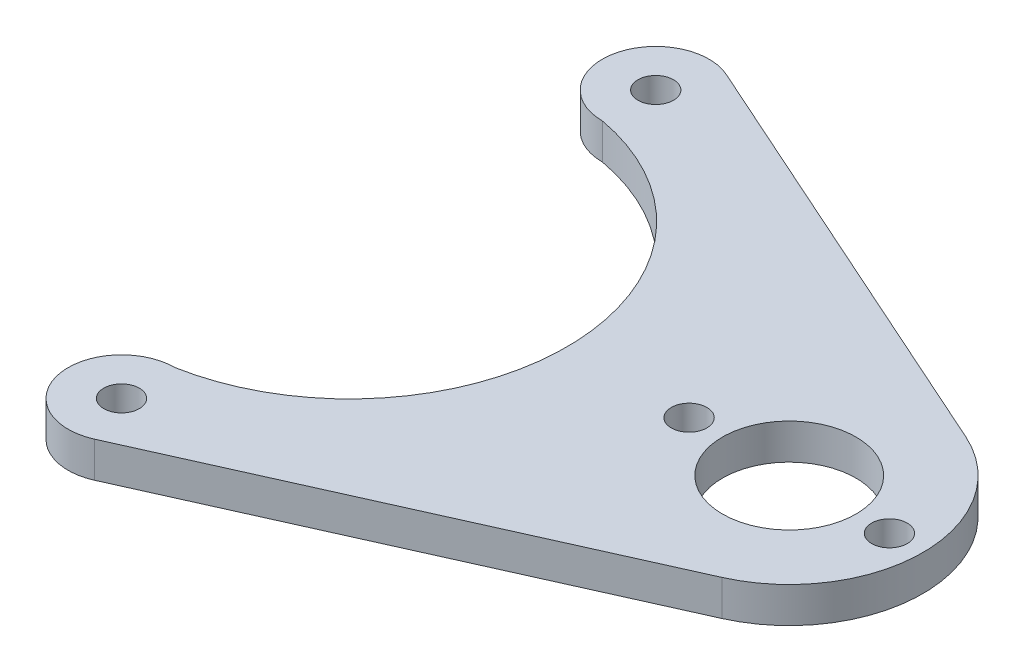
ISO-10303-21;
HEADER;
FILE_DESCRIPTION(('STEP AP214'),'2;1');
FILE_NAME('part.step','',(''),(''),'','','');
FILE_SCHEMA(('AUTOMOTIVE_DESIGN { 1 0 10303 214 1 1 1 1 }'));
ENDSEC;
DATA;
#1=APPLICATION_CONTEXT('core data for automotive mechanical design processes');
#2=APPLICATION_PROTOCOL_DEFINITION('international standard','automotive_design',2000,#1);
#3=PRODUCT_CONTEXT('',#1,'mechanical');
#4=PRODUCT('Part','Part','',(#3));
#5=PRODUCT_RELATED_PRODUCT_CATEGORY('part','',(#4));
#6=PRODUCT_DEFINITION_FORMATION('','',#4);
#7=PRODUCT_DEFINITION_CONTEXT('part definition',#1,'design');
#8=PRODUCT_DEFINITION('design','',#6,#7);
#9=PRODUCT_DEFINITION_SHAPE('','',#8);
#10=(LENGTH_UNIT() NAMED_UNIT(*) SI_UNIT(.MILLI.,.METRE.));
#11=(NAMED_UNIT(*) PLANE_ANGLE_UNIT() SI_UNIT($,.RADIAN.));
#12=(NAMED_UNIT(*) SI_UNIT($,.STERADIAN.) SOLID_ANGLE_UNIT());
#13=UNCERTAINTY_MEASURE_WITH_UNIT(LENGTH_MEASURE(1.E-05),#10,'distance_accuracy_value','');
#14=(GEOMETRIC_REPRESENTATION_CONTEXT(3) GLOBAL_UNCERTAINTY_ASSIGNED_CONTEXT((#13)) GLOBAL_UNIT_ASSIGNED_CONTEXT((#10,
#11,#12)) REPRESENTATION_CONTEXT('',''));
#15=CARTESIAN_POINT('',(0.,0.,0.));
#16=DIRECTION('',(0.,0.,1.));
#17=DIRECTION('',(1.,0.,0.));
#18=AXIS2_PLACEMENT_3D('',#15,#16,#17);
#19=CARTESIAN_POINT('',(-90.,8.,-60.));
#20=DIRECTION('',(0.,1.,0.));
#21=DIRECTION('',(0.,0.,1.));
#22=AXIS2_PLACEMENT_3D('',#19,#20,#21);
#23=PLANE('',#22);
#24=CARTESIAN_POINT('',(-22.5,8.,0.));
#25=DIRECTION('',(0.,1.,0.));
#26=DIRECTION('',(0.,0.,1.));
#27=AXIS2_PLACEMENT_3D('',#24,#25,#26);
#28=CIRCLE('',#27,4.);
#29=CARTESIAN_POINT('',(-22.5,8.,4.));
#30=VERTEX_POINT('',#29);
#31=EDGE_CURVE('E203',#30,#30,#28,.T.);
#32=ORIENTED_EDGE('',*,*,#31,.F.);
#33=EDGE_LOOP('',(#32));
#34=FACE_BOUND('',#33,.T.);
#35=CARTESIAN_POINT('',(-90.,8.,60.));
#36=DIRECTION('',(0.,1.,0.));
#37=DIRECTION('',(0.,0.,1.));
#38=AXIS2_PLACEMENT_3D('',#35,#36,#37);
#39=CIRCLE('',#38,4.00000000000001);
#40=CARTESIAN_POINT('',(-90.,8.,64.));
#41=VERTEX_POINT('',#40);
#42=EDGE_CURVE('E215',#41,#41,#39,.T.);
#43=ORIENTED_EDGE('',*,*,#42,.F.);
#44=EDGE_LOOP('',(#43));
#45=FACE_BOUND('',#44,.T.);
#46=CARTESIAN_POINT('',(-90.,8.,-60.));
#47=DIRECTION('',(0.,1.,0.));
#48=DIRECTION('',(0.,0.,1.));
#49=AXIS2_PLACEMENT_3D('',#46,#47,#48);
#50=CIRCLE('',#49,12.);
#51=CARTESIAN_POINT('',(-85.0979487379824,8.,-70.9530768930265));
#52=VERTEX_POINT('',#51);
#53=CARTESIAN_POINT('',(-90.,8.,-48.));
#54=VERTEX_POINT('',#53);
#55=EDGE_CURVE('E139',#52,#54,#50,.T.);
#56=ORIENTED_EDGE('',*,*,#55,.T.);
#57=CARTESIAN_POINT('',(-98.8,8.,0.));
#58=DIRECTION('',(0.,-1.,0.));
#59=DIRECTION('',(0.,0.,-1.));
#60=AXIS2_PLACEMENT_3D('',#57,#58,#59);
#61=CIRCLE('',#60,48.8);
#62=CARTESIAN_POINT('',(-90.,8.,48.));
#63=VERTEX_POINT('',#62);
#64=EDGE_CURVE('E97',#54,#63,#61,.T.);
#65=ORIENTED_EDGE('',*,*,#64,.T.);
#66=CARTESIAN_POINT('',(-90.,8.,60.));
#67=DIRECTION('',(0.,1.,0.));
#68=DIRECTION('',(0.,0.,1.));
#69=AXIS2_PLACEMENT_3D('',#66,#67,#68);
#70=CIRCLE('',#69,12.);
#71=CARTESIAN_POINT('',(-85.0979487379823,8.,70.9530768930265));
#72=VERTEX_POINT('',#71);
#73=EDGE_CURVE('E110',#63,#72,#70,.T.);
#74=ORIENTED_EDGE('',*,*,#73,.T.);
#75=DIRECTION('',(0.912756407752208,0.,-0.408504271834806));
#76=VECTOR('',#75,1.);
#77=CARTESIAN_POINT('',(12.2551281550442,8.,27.3826922325662));
#78=LINE('',#77,#76);
#79=CARTESIAN_POINT('',(12.2551281550442,8.,27.3826922325662));
#80=VERTEX_POINT('',#79);
#81=EDGE_CURVE('E104',#72,#80,#78,.T.);
#82=ORIENTED_EDGE('',*,*,#81,.T.);
#83=CARTESIAN_POINT('',(0.,8.,0.));
#84=DIRECTION('',(0.,1.,0.));
#85=DIRECTION('',(0.,0.,1.));
#86=AXIS2_PLACEMENT_3D('',#83,#84,#85);
#87=CIRCLE('',#86,30.);
#88=CARTESIAN_POINT('',(12.2551281550442,8.,-27.3826922325663));
#89=VERTEX_POINT('',#88);
#90=EDGE_CURVE('E108',#80,#89,#87,.T.);
#91=ORIENTED_EDGE('',*,*,#90,.T.);
#92=DIRECTION('',(-0.912756407752208,0.,-0.408504271834805));
#93=VECTOR('',#92,1.);
#94=CARTESIAN_POINT('',(-85.0979487379824,8.,-70.9530768930265));
#95=LINE('',#94,#93);
#96=EDGE_CURVE('E60',#89,#52,#95,.T.);
#97=ORIENTED_EDGE('',*,*,#96,.T.);
#98=EDGE_LOOP('',(#56,#65,#74,#82,#91,#97));
#99=FACE_BOUND('',#98,.T.);
#100=CARTESIAN_POINT('',(-90.,8.,-60.));
#101=DIRECTION('',(0.,1.,0.));
#102=DIRECTION('',(0.,0.,1.));
#103=AXIS2_PLACEMENT_3D('',#100,#101,#102);
#104=CIRCLE('',#103,4.00000000000001);
#105=CARTESIAN_POINT('',(-90.,8.,-56.));
#106=VERTEX_POINT('',#105);
#107=EDGE_CURVE('E132',#106,#106,#104,.T.);
#108=ORIENTED_EDGE('',*,*,#107,.F.);
#109=EDGE_LOOP('',(#108));
#110=FACE_BOUND('',#109,.T.);
#111=CARTESIAN_POINT('',(22.5,8.,0.));
#112=DIRECTION('',(0.,1.,0.));
#113=DIRECTION('',(0.,0.,1.));
#114=AXIS2_PLACEMENT_3D('',#111,#112,#113);
#115=CIRCLE('',#114,4.);
#116=CARTESIAN_POINT('',(22.5,8.,4.));
#117=VERTEX_POINT('',#116);
#118=EDGE_CURVE('E209',#117,#117,#115,.T.);
#119=ORIENTED_EDGE('',*,*,#118,.F.);
#120=EDGE_LOOP('',(#119));
#121=FACE_BOUND('',#120,.T.);
#122=CARTESIAN_POINT('',(0.,8.,0.));
#123=DIRECTION('',(0.,1.,0.));
#124=DIRECTION('',(0.,0.,1.));
#125=AXIS2_PLACEMENT_3D('',#122,#123,#124);
#126=CIRCLE('',#125,15.);
#127=CARTESIAN_POINT('',(0.,8.,15.));
#128=VERTEX_POINT('',#127);
#129=EDGE_CURVE('E194',#128,#128,#126,.T.);
#130=ORIENTED_EDGE('',*,*,#129,.F.);
#131=EDGE_LOOP('',(#130));
#132=FACE_BOUND('',#131,.T.);
#133=ADVANCED_FACE('F43',(#34,#45,#99,#110,#121,#132),#23,.T.);
#134=CARTESIAN_POINT('',(-90.,0.,-60.));
#135=DIRECTION('',(0.,1.,0.));
#136=DIRECTION('',(0.,0.,1.));
#137=AXIS2_PLACEMENT_3D('',#134,#135,#136);
#138=PLANE('',#137);
#139=CARTESIAN_POINT('',(-90.,0.,-60.));
#140=DIRECTION('',(0.,1.,0.));
#141=DIRECTION('',(0.,0.,1.));
#142=AXIS2_PLACEMENT_3D('',#139,#140,#141);
#143=CIRCLE('',#142,12.);
#144=CARTESIAN_POINT('',(-85.0979487379824,0.,-70.9530768930265));
#145=VERTEX_POINT('',#144);
#146=CARTESIAN_POINT('',(-90.,0.,-48.));
#147=VERTEX_POINT('',#146);
#148=EDGE_CURVE('E128',#145,#147,#143,.T.);
#149=ORIENTED_EDGE('',*,*,#148,.F.);
#150=DIRECTION('',(-0.912756407752208,0.,-0.408504271834805));
#151=VECTOR('',#150,1.);
#152=CARTESIAN_POINT('',(-85.0979487379824,0.,-70.9530768930265));
#153=LINE('',#152,#151);
#154=CARTESIAN_POINT('',(12.2551281550442,0.,-27.3826922325663));
#155=VERTEX_POINT('',#154);
#156=EDGE_CURVE('E89',#155,#145,#153,.T.);
#157=ORIENTED_EDGE('',*,*,#156,.F.);
#158=CARTESIAN_POINT('',(0.,0.,0.));
#159=DIRECTION('',(0.,1.,0.));
#160=DIRECTION('',(0.,0.,1.));
#161=AXIS2_PLACEMENT_3D('',#158,#159,#160);
#162=CIRCLE('',#161,30.);
#163=CARTESIAN_POINT('',(12.2551281550442,0.,27.3826922325662));
#164=VERTEX_POINT('',#163);
#165=EDGE_CURVE('E83',#164,#155,#162,.T.);
#166=ORIENTED_EDGE('',*,*,#165,.F.);
#167=DIRECTION('',(0.912756407752208,0.,-0.408504271834806));
#168=VECTOR('',#167,1.);
#169=CARTESIAN_POINT('',(12.2551281550442,0.,27.3826922325662));
#170=LINE('',#169,#168);
#171=CARTESIAN_POINT('',(-85.0979487379823,0.,70.9530768930265));
#172=VERTEX_POINT('',#171);
#173=EDGE_CURVE('E118',#172,#164,#170,.T.);
#174=ORIENTED_EDGE('',*,*,#173,.F.);
#175=CARTESIAN_POINT('',(-90.,0.,60.));
#176=DIRECTION('',(0.,1.,0.));
#177=DIRECTION('',(0.,0.,1.));
#178=AXIS2_PLACEMENT_3D('',#175,#176,#177);
#179=CIRCLE('',#178,12.);
#180=CARTESIAN_POINT('',(-90.,0.,48.));
#181=VERTEX_POINT('',#180);
#182=EDGE_CURVE('E134',#181,#172,#179,.T.);
#183=ORIENTED_EDGE('',*,*,#182,.F.);
#184=CARTESIAN_POINT('',(-98.8,0.,0.));
#185=DIRECTION('',(0.,-1.,0.));
#186=DIRECTION('',(0.,0.,-1.));
#187=AXIS2_PLACEMENT_3D('',#184,#185,#186);
#188=CIRCLE('',#187,48.8);
#189=EDGE_CURVE('E131',#147,#181,#188,.T.);
#190=ORIENTED_EDGE('',*,*,#189,.F.);
#191=EDGE_LOOP('',(#149,#157,#166,#174,#183,#190));
#192=FACE_BOUND('',#191,.T.);
#193=CARTESIAN_POINT('',(-90.,0.,-60.));
#194=DIRECTION('',(0.,1.,0.));
#195=DIRECTION('',(0.,0.,1.));
#196=AXIS2_PLACEMENT_3D('',#193,#194,#195);
#197=CIRCLE('',#196,4.00000000000001);
#198=CARTESIAN_POINT('',(-90.,0.,-56.));
#199=VERTEX_POINT('',#198);
#200=EDGE_CURVE('E218',#199,#199,#197,.T.);
#201=ORIENTED_EDGE('',*,*,#200,.T.);
#202=EDGE_LOOP('',(#201));
#203=FACE_BOUND('',#202,.T.);
#204=CARTESIAN_POINT('',(-90.,0.,60.));
#205=DIRECTION('',(0.,1.,0.));
#206=DIRECTION('',(0.,0.,1.));
#207=AXIS2_PLACEMENT_3D('',#204,#205,#206);
#208=CIRCLE('',#207,4.00000000000001);
#209=CARTESIAN_POINT('',(-90.,0.,64.));
#210=VERTEX_POINT('',#209);
#211=EDGE_CURVE('E212',#210,#210,#208,.T.);
#212=ORIENTED_EDGE('',*,*,#211,.T.);
#213=EDGE_LOOP('',(#212));
#214=FACE_BOUND('',#213,.T.);
#215=CARTESIAN_POINT('',(22.5,0.,0.));
#216=DIRECTION('',(0.,1.,0.));
#217=DIRECTION('',(0.,0.,1.));
#218=AXIS2_PLACEMENT_3D('',#215,#216,#217);
#219=CIRCLE('',#218,4.);
#220=CARTESIAN_POINT('',(22.5,0.,4.));
#221=VERTEX_POINT('',#220);
#222=EDGE_CURVE('E206',#221,#221,#219,.T.);
#223=ORIENTED_EDGE('',*,*,#222,.T.);
#224=EDGE_LOOP('',(#223));
#225=FACE_BOUND('',#224,.T.);
#226=CARTESIAN_POINT('',(-22.5,0.,0.));
#227=DIRECTION('',(0.,1.,0.));
#228=DIRECTION('',(0.,0.,1.));
#229=AXIS2_PLACEMENT_3D('',#226,#227,#228);
#230=CIRCLE('',#229,4.);
#231=CARTESIAN_POINT('',(-22.5,0.,4.));
#232=VERTEX_POINT('',#231);
#233=EDGE_CURVE('E200',#232,#232,#230,.T.);
#234=ORIENTED_EDGE('',*,*,#233,.T.);
#235=EDGE_LOOP('',(#234));
#236=FACE_BOUND('',#235,.T.);
#237=CARTESIAN_POINT('',(0.,0.,0.));
#238=DIRECTION('',(0.,1.,0.));
#239=DIRECTION('',(0.,0.,1.));
#240=AXIS2_PLACEMENT_3D('',#237,#238,#239);
#241=CIRCLE('',#240,15.);
#242=CARTESIAN_POINT('',(0.,0.,15.));
#243=VERTEX_POINT('',#242);
#244=EDGE_CURVE('E197',#243,#243,#241,.T.);
#245=ORIENTED_EDGE('',*,*,#244,.T.);
#246=EDGE_LOOP('',(#245));
#247=FACE_BOUND('',#246,.T.);
#248=ADVANCED_FACE('F148',(#192,#203,#214,#225,#236,#247),#138,.F.);
#249=CARTESIAN_POINT('',(-90.,8.,-60.));
#250=DIRECTION('',(0.,-1.,0.));
#251=DIRECTION('',(0.,0.,-1.));
#252=AXIS2_PLACEMENT_3D('',#249,#250,#251);
#253=CYLINDRICAL_SURFACE('',#252,12.);
#254=ORIENTED_EDGE('',*,*,#148,.T.);
#255=DIRECTION('',(0.,-1.,0.));
#256=VECTOR('',#255,1.);
#257=CARTESIAN_POINT('',(-90.,8.,-48.));
#258=LINE('',#257,#256);
#259=EDGE_CURVE('E11',#54,#147,#258,.T.);
#260=ORIENTED_EDGE('',*,*,#259,.F.);
#261=ORIENTED_EDGE('',*,*,#55,.F.);
#262=DIRECTION('',(0.,-1.,0.));
#263=VECTOR('',#262,1.);
#264=CARTESIAN_POINT('',(-85.0979487379824,8.,-70.9530768930265));
#265=LINE('',#264,#263);
#266=EDGE_CURVE('E124',#52,#145,#265,.T.);
#267=ORIENTED_EDGE('',*,*,#266,.T.);
#268=EDGE_LOOP('',(#254,#260,#261,#267));
#269=FACE_BOUND('',#268,.T.);
#270=ADVANCED_FACE('F45',(#269),#253,.T.);
#271=CARTESIAN_POINT('',(-98.8,8.,0.));
#272=DIRECTION('',(0.,-1.,0.));
#273=DIRECTION('',(0.,0.,-1.));
#274=AXIS2_PLACEMENT_3D('',#271,#272,#273);
#275=CYLINDRICAL_SURFACE('',#274,48.8);
#276=ORIENTED_EDGE('',*,*,#189,.T.);
#277=DIRECTION('',(0.,-1.,0.));
#278=VECTOR('',#277,1.);
#279=CARTESIAN_POINT('',(-90.,8.,48.));
#280=LINE('',#279,#278);
#281=EDGE_CURVE('E52',#63,#181,#280,.T.);
#282=ORIENTED_EDGE('',*,*,#281,.F.);
#283=ORIENTED_EDGE('',*,*,#64,.F.);
#284=ORIENTED_EDGE('',*,*,#259,.T.);
#285=EDGE_LOOP('',(#276,#282,#283,#284));
#286=FACE_BOUND('',#285,.T.);
#287=ADVANCED_FACE('F285',(#286),#275,.F.);
#288=CARTESIAN_POINT('',(-90.,8.,60.));
#289=DIRECTION('',(0.,-1.,0.));
#290=DIRECTION('',(0.,0.,-1.));
#291=AXIS2_PLACEMENT_3D('',#288,#289,#290);
#292=CYLINDRICAL_SURFACE('',#291,12.);
#293=ORIENTED_EDGE('',*,*,#182,.T.);
#294=DIRECTION('',(0.,-1.,0.));
#295=VECTOR('',#294,1.);
#296=CARTESIAN_POINT('',(-85.0979487379823,8.,70.9530768930265));
#297=LINE('',#296,#295);
#298=EDGE_CURVE('E119',#72,#172,#297,.T.);
#299=ORIENTED_EDGE('',*,*,#298,.F.);
#300=ORIENTED_EDGE('',*,*,#73,.F.);
#301=ORIENTED_EDGE('',*,*,#281,.T.);
#302=EDGE_LOOP('',(#293,#299,#300,#301));
#303=FACE_BOUND('',#302,.T.);
#304=ADVANCED_FACE('F145',(#303),#292,.T.);
#305=CARTESIAN_POINT('',(12.2551281550442,8.,27.3826922325662));
#306=DIRECTION('',(-0.408504271834806,0.,-0.912756407752208));
#307=DIRECTION('',(-0.912756407752208,0.,0.408504271834806));
#308=AXIS2_PLACEMENT_3D('',#305,#306,#307);
#309=PLANE('',#308);
#310=ORIENTED_EDGE('',*,*,#173,.T.);
#311=DIRECTION('',(0.,-1.,0.));
#312=VECTOR('',#311,1.);
#313=CARTESIAN_POINT('',(12.2551281550442,8.,27.3826922325662));
#314=LINE('',#313,#312);
#315=EDGE_CURVE('E115',#80,#164,#314,.T.);
#316=ORIENTED_EDGE('',*,*,#315,.F.);
#317=ORIENTED_EDGE('',*,*,#81,.F.);
#318=ORIENTED_EDGE('',*,*,#298,.T.);
#319=EDGE_LOOP('',(#310,#316,#317,#318));
#320=FACE_BOUND('',#319,.T.);
#321=ADVANCED_FACE('F116',(#320),#309,.F.);
#322=CARTESIAN_POINT('',(0.,8.,0.));
#323=DIRECTION('',(0.,-1.,0.));
#324=DIRECTION('',(0.,0.,-1.));
#325=AXIS2_PLACEMENT_3D('',#322,#323,#324);
#326=CYLINDRICAL_SURFACE('',#325,30.);
#327=ORIENTED_EDGE('',*,*,#165,.T.);
#328=DIRECTION('',(0.,-1.,0.));
#329=VECTOR('',#328,1.);
#330=CARTESIAN_POINT('',(12.2551281550442,8.,-27.3826922325663));
#331=LINE('',#330,#329);
#332=EDGE_CURVE('E120',#89,#155,#331,.T.);
#333=ORIENTED_EDGE('',*,*,#332,.F.);
#334=ORIENTED_EDGE('',*,*,#90,.F.);
#335=ORIENTED_EDGE('',*,*,#315,.T.);
#336=EDGE_LOOP('',(#327,#333,#334,#335));
#337=FACE_BOUND('',#336,.T.);
#338=ADVANCED_FACE('F122',(#337),#326,.T.);
#339=CARTESIAN_POINT('',(-85.0979487379824,8.,-70.9530768930265));
#340=DIRECTION('',(-0.408504271834805,0.,0.912756407752208));
#341=DIRECTION('',(0.912756407752208,0.,0.408504271834805));
#342=AXIS2_PLACEMENT_3D('',#339,#340,#341);
#343=PLANE('',#342);
#344=ORIENTED_EDGE('',*,*,#156,.T.);
#345=ORIENTED_EDGE('',*,*,#266,.F.);
#346=ORIENTED_EDGE('',*,*,#96,.F.);
#347=ORIENTED_EDGE('',*,*,#332,.T.);
#348=EDGE_LOOP('',(#344,#345,#346,#347));
#349=FACE_BOUND('',#348,.T.);
#350=ADVANCED_FACE('F153',(#349),#343,.F.);
#351=CARTESIAN_POINT('',(-90.,8.,-60.));
#352=DIRECTION('',(0.,-1.,0.));
#353=DIRECTION('',(0.,0.,-1.));
#354=AXIS2_PLACEMENT_3D('',#351,#352,#353);
#355=CYLINDRICAL_SURFACE('',#354,4.00000000000001);
#356=ORIENTED_EDGE('',*,*,#107,.T.);
#357=EDGE_LOOP('',(#356));
#358=FACE_BOUND('',#357,.T.);
#359=ORIENTED_EDGE('',*,*,#200,.F.);
#360=EDGE_LOOP('',(#359));
#361=FACE_BOUND('',#360,.T.);
#362=ADVANCED_FACE('F155',(#358,#361),#355,.F.);
#363=CARTESIAN_POINT('',(-90.,8.,60.));
#364=DIRECTION('',(0.,-1.,0.));
#365=DIRECTION('',(0.,0.,-1.));
#366=AXIS2_PLACEMENT_3D('',#363,#364,#365);
#367=CYLINDRICAL_SURFACE('',#366,4.00000000000001);
#368=ORIENTED_EDGE('',*,*,#42,.T.);
#369=EDGE_LOOP('',(#368));
#370=FACE_BOUND('',#369,.T.);
#371=ORIENTED_EDGE('',*,*,#211,.F.);
#372=EDGE_LOOP('',(#371));
#373=FACE_BOUND('',#372,.T.);
#374=ADVANCED_FACE('F161',(#370,#373),#367,.F.);
#375=CARTESIAN_POINT('',(22.5,8.,0.));
#376=DIRECTION('',(0.,-1.,0.));
#377=DIRECTION('',(0.,0.,-1.));
#378=AXIS2_PLACEMENT_3D('',#375,#376,#377);
#379=CYLINDRICAL_SURFACE('',#378,4.);
#380=ORIENTED_EDGE('',*,*,#118,.T.);
#381=EDGE_LOOP('',(#380));
#382=FACE_BOUND('',#381,.T.);
#383=ORIENTED_EDGE('',*,*,#222,.F.);
#384=EDGE_LOOP('',(#383));
#385=FACE_BOUND('',#384,.T.);
#386=ADVANCED_FACE('F177',(#382,#385),#379,.F.);
#387=CARTESIAN_POINT('',(-22.5,8.,0.));
#388=DIRECTION('',(0.,-1.,0.));
#389=DIRECTION('',(0.,0.,-1.));
#390=AXIS2_PLACEMENT_3D('',#387,#388,#389);
#391=CYLINDRICAL_SURFACE('',#390,4.);
#392=ORIENTED_EDGE('',*,*,#31,.T.);
#393=EDGE_LOOP('',(#392));
#394=FACE_BOUND('',#393,.T.);
#395=ORIENTED_EDGE('',*,*,#233,.F.);
#396=EDGE_LOOP('',(#395));
#397=FACE_BOUND('',#396,.T.);
#398=ADVANCED_FACE('F181',(#394,#397),#391,.F.);
#399=CARTESIAN_POINT('',(0.,8.,0.));
#400=DIRECTION('',(0.,-1.,0.));
#401=DIRECTION('',(0.,0.,-1.));
#402=AXIS2_PLACEMENT_3D('',#399,#400,#401);
#403=CYLINDRICAL_SURFACE('',#402,15.);
#404=ORIENTED_EDGE('',*,*,#129,.T.);
#405=EDGE_LOOP('',(#404));
#406=FACE_BOUND('',#405,.T.);
#407=ORIENTED_EDGE('',*,*,#244,.F.);
#408=EDGE_LOOP('',(#407));
#409=FACE_BOUND('',#408,.T.);
#410=ADVANCED_FACE('F185',(#406,#409),#403,.F.);
#411=CLOSED_SHELL('',(#133,#248,#270,#287,#304,#321,#338,#350,#362,#374,#386,#398,#410));
#412=MANIFOLD_SOLID_BREP('B2',#411);
#413=ADVANCED_BREP_SHAPE_REPRESENTATION('',(#18,#412),#14);
#414=SHAPE_DEFINITION_REPRESENTATION(#9,#413);
ENDSEC;
END-ISO-10303-21;
